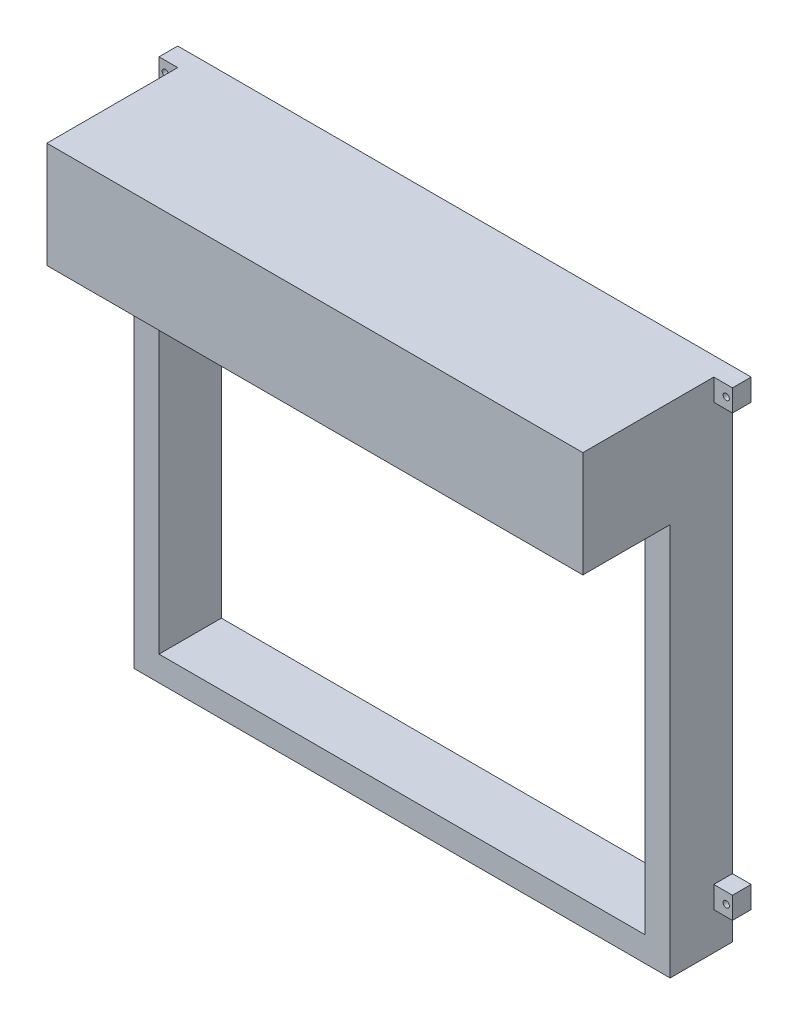
ISO-10303-21;
HEADER;
FILE_DESCRIPTION(('STEP AP214'),'2;1');
FILE_NAME('part.step','',(''),(''),'','','');
FILE_SCHEMA(('AUTOMOTIVE_DESIGN { 1 0 10303 214 1 1 1 1 }'));
ENDSEC;
DATA;
#1=APPLICATION_CONTEXT('core data for automotive mechanical design processes');
#2=APPLICATION_PROTOCOL_DEFINITION('international standard','automotive_design',2000,#1);
#3=PRODUCT_CONTEXT('',#1,'mechanical');
#4=PRODUCT('Part','Part','',(#3));
#5=PRODUCT_RELATED_PRODUCT_CATEGORY('part','',(#4));
#6=PRODUCT_DEFINITION_FORMATION('','',#4);
#7=PRODUCT_DEFINITION_CONTEXT('part definition',#1,'design');
#8=PRODUCT_DEFINITION('design','',#6,#7);
#9=PRODUCT_DEFINITION_SHAPE('','',#8);
#10=(LENGTH_UNIT() NAMED_UNIT(*) SI_UNIT(.MILLI.,.METRE.));
#11=(NAMED_UNIT(*) PLANE_ANGLE_UNIT() SI_UNIT($,.RADIAN.));
#12=(NAMED_UNIT(*) SI_UNIT($,.STERADIAN.) SOLID_ANGLE_UNIT());
#13=UNCERTAINTY_MEASURE_WITH_UNIT(LENGTH_MEASURE(1.E-05),#10,'distance_accuracy_value','');
#14=(GEOMETRIC_REPRESENTATION_CONTEXT(3) GLOBAL_UNCERTAINTY_ASSIGNED_CONTEXT((#13)) GLOBAL_UNIT_ASSIGNED_CONTEXT((#10,
#11,#12)) REPRESENTATION_CONTEXT('',''));
#15=CARTESIAN_POINT('',(0.,0.,0.));
#16=DIRECTION('',(0.,0.,1.));
#17=DIRECTION('',(1.,0.,0.));
#18=AXIS2_PLACEMENT_3D('',#15,#16,#17);
#19=CARTESIAN_POINT('',(860.,1.2490009027033E-13,100.));
#20=DIRECTION('',(1.,0.,0.));
#21=DIRECTION('',(0.,1.,0.));
#22=AXIS2_PLACEMENT_3D('',#19,#20,#21);
#23=PLANE('',#22);
#24=DIRECTION('',(0.,-1.,0.));
#25=VECTOR('',#24,1.);
#26=CARTESIAN_POINT('',(860.,1.2490009027033E-13,0.));
#27=LINE('',#26,#25);
#28=CARTESIAN_POINT('',(860.,765.,0.));
#29=VERTEX_POINT('',#28);
#30=CARTESIAN_POINT('',(860.,95.0000000000001,0.));
#31=VERTEX_POINT('',#30);
#32=EDGE_CURVE('E403',#29,#31,#27,.T.);
#33=ORIENTED_EDGE('',*,*,#32,.F.);
#34=DIRECTION('',(0.,0.,-1.));
#35=VECTOR('',#34,1.);
#36=CARTESIAN_POINT('',(860.,765.,30.));
#37=LINE('',#36,#35);
#38=CARTESIAN_POINT('',(860.,765.,30.));
#39=VERTEX_POINT('',#38);
#40=EDGE_CURVE('E256',#39,#29,#37,.T.);
#41=ORIENTED_EDGE('',*,*,#40,.F.);
#42=DIRECTION('',(0.,-1.,0.));
#43=VECTOR('',#42,1.);
#44=CARTESIAN_POINT('',(860.,1.2490009027033E-13,30.));
#45=LINE('',#44,#43);
#46=CARTESIAN_POINT('',(860.,800.,30.));
#47=VERTEX_POINT('',#46);
#48=EDGE_CURVE('E273',#47,#39,#45,.T.);
#49=ORIENTED_EDGE('',*,*,#48,.F.);
#50=DIRECTION('',(0.,0.,-1.));
#51=VECTOR('',#50,1.);
#52=CARTESIAN_POINT('',(860.,800.,240.));
#53=LINE('',#52,#51);
#54=CARTESIAN_POINT('',(860.,800.,240.));
#55=VERTEX_POINT('',#54);
#56=EDGE_CURVE('E366',#55,#47,#53,.T.);
#57=ORIENTED_EDGE('',*,*,#56,.F.);
#58=DIRECTION('',(0.,-1.,0.));
#59=VECTOR('',#58,1.);
#60=CARTESIAN_POINT('',(860.,1.2490009027033E-13,240.));
#61=LINE('',#60,#59);
#62=CARTESIAN_POINT('',(860.,630.,240.));
#63=VERTEX_POINT('',#62);
#64=EDGE_CURVE('E357',#55,#63,#61,.T.);
#65=ORIENTED_EDGE('',*,*,#64,.T.);
#66=DIRECTION('',(0.,0.,-1.));
#67=VECTOR('',#66,1.);
#68=CARTESIAN_POINT('',(860.,630.,240.));
#69=LINE('',#68,#67);
#70=CARTESIAN_POINT('',(860.,630.,100.));
#71=VERTEX_POINT('',#70);
#72=EDGE_CURVE('E369',#63,#71,#69,.T.);
#73=ORIENTED_EDGE('',*,*,#72,.T.);
#74=DIRECTION('',(0.,-1.,0.));
#75=VECTOR('',#74,1.);
#76=CARTESIAN_POINT('',(860.,1.2490009027033E-13,100.));
#77=LINE('',#76,#75);
#78=CARTESIAN_POINT('',(860.,0.,100.));
#79=VERTEX_POINT('',#78);
#80=EDGE_CURVE('E385',#71,#79,#77,.T.);
#81=ORIENTED_EDGE('',*,*,#80,.T.);
#82=DIRECTION('',(0.,0.,-1.));
#83=VECTOR('',#82,1.);
#84=CARTESIAN_POINT('',(860.,0.,100.));
#85=LINE('',#84,#83);
#86=CARTESIAN_POINT('',(860.,0.,0.));
#87=VERTEX_POINT('',#86);
#88=EDGE_CURVE('E59',#79,#87,#85,.T.);
#89=ORIENTED_EDGE('',*,*,#88,.T.);
#90=CARTESIAN_POINT('',(860.,60.0000000000001,0.));
#91=VERTEX_POINT('',#90);
#92=EDGE_CURVE('E402',#91,#87,#27,.T.);
#93=ORIENTED_EDGE('',*,*,#92,.F.);
#94=DIRECTION('',(0.,0.,-1.));
#95=VECTOR('',#94,1.);
#96=CARTESIAN_POINT('',(860.,60.0000000000001,30.));
#97=LINE('',#96,#95);
#98=CARTESIAN_POINT('',(860.,60.0000000000001,30.));
#99=VERTEX_POINT('',#98);
#100=EDGE_CURVE('E290',#99,#91,#97,.T.);
#101=ORIENTED_EDGE('',*,*,#100,.F.);
#102=DIRECTION('',(0.,-1.,0.));
#103=VECTOR('',#102,1.);
#104=CARTESIAN_POINT('',(860.,1.2490009027033E-13,30.));
#105=LINE('',#104,#103);
#106=CARTESIAN_POINT('',(860.,95.0000000000001,30.));
#107=VERTEX_POINT('',#106);
#108=EDGE_CURVE('E292',#107,#99,#105,.T.);
#109=ORIENTED_EDGE('',*,*,#108,.F.);
#110=DIRECTION('',(0.,0.,-1.));
#111=VECTOR('',#110,1.);
#112=CARTESIAN_POINT('',(860.,95.0000000000001,30.));
#113=LINE('',#112,#111);
#114=EDGE_CURVE('E287',#107,#31,#113,.T.);
#115=ORIENTED_EDGE('',*,*,#114,.T.);
#116=EDGE_LOOP('',(#33,#41,#49,#57,#65,#73,#81,#89,#93,#101,#109,#115));
#117=FACE_BOUND('',#116,.T.);
#118=ADVANCED_FACE('F51',(#117),#23,.T.);
#119=CARTESIAN_POINT('',(0.,0.,100.));
#120=DIRECTION('',(-1.,0.,0.));
#121=DIRECTION('',(0.,0.,1.));
#122=AXIS2_PLACEMENT_3D('',#119,#120,#121);
#123=PLANE('',#122);
#124=DIRECTION('',(0.,-1.,0.));
#125=VECTOR('',#124,1.);
#126=CARTESIAN_POINT('',(0.,800.,30.));
#127=LINE('',#126,#125);
#128=CARTESIAN_POINT('',(0.,800.,30.));
#129=VERTEX_POINT('',#128);
#130=CARTESIAN_POINT('',(0.,765.,30.));
#131=VERTEX_POINT('',#130);
#132=EDGE_CURVE('E66',#129,#131,#127,.T.);
#133=ORIENTED_EDGE('',*,*,#132,.T.);
#134=DIRECTION('',(0.,0.,-1.));
#135=VECTOR('',#134,1.);
#136=CARTESIAN_POINT('',(0.,765.,30.));
#137=LINE('',#136,#135);
#138=CARTESIAN_POINT('',(0.,765.,0.));
#139=VERTEX_POINT('',#138);
#140=EDGE_CURVE('E70',#131,#139,#137,.T.);
#141=ORIENTED_EDGE('',*,*,#140,.T.);
#142=DIRECTION('',(0.,1.,0.));
#143=VECTOR('',#142,1.);
#144=CARTESIAN_POINT('',(0.,0.,0.));
#145=LINE('',#144,#143);
#146=CARTESIAN_POINT('',(0.,94.9999999999999,0.));
#147=VERTEX_POINT('',#146);
#148=EDGE_CURVE('E374',#147,#139,#145,.T.);
#149=ORIENTED_EDGE('',*,*,#148,.F.);
#150=DIRECTION('',(0.,0.,-1.));
#151=VECTOR('',#150,1.);
#152=CARTESIAN_POINT('',(0.,94.9999999999999,30.));
#153=LINE('',#152,#151);
#154=CARTESIAN_POINT('',(0.,94.9999999999999,30.));
#155=VERTEX_POINT('',#154);
#156=EDGE_CURVE('E345',#155,#147,#153,.T.);
#157=ORIENTED_EDGE('',*,*,#156,.F.);
#158=DIRECTION('',(0.,1.,0.));
#159=VECTOR('',#158,1.);
#160=CARTESIAN_POINT('',(0.,0.,30.));
#161=LINE('',#160,#159);
#162=CARTESIAN_POINT('',(0.,59.9999999999999,30.));
#163=VERTEX_POINT('',#162);
#164=EDGE_CURVE('E328',#163,#155,#161,.T.);
#165=ORIENTED_EDGE('',*,*,#164,.F.);
#166=DIRECTION('',(0.,0.,-1.));
#167=VECTOR('',#166,1.);
#168=CARTESIAN_POINT('',(0.,59.9999999999999,30.));
#169=LINE('',#168,#167);
#170=CARTESIAN_POINT('',(0.,59.9999999999999,0.));
#171=VERTEX_POINT('',#170);
#172=EDGE_CURVE('E348',#163,#171,#169,.T.);
#173=ORIENTED_EDGE('',*,*,#172,.T.);
#174=CARTESIAN_POINT('',(0.,0.,0.));
#175=VERTEX_POINT('',#174);
#176=EDGE_CURVE('E396',#175,#171,#145,.T.);
#177=ORIENTED_EDGE('',*,*,#176,.F.);
#178=DIRECTION('',(0.,0.,-1.));
#179=VECTOR('',#178,1.);
#180=CARTESIAN_POINT('',(0.,0.,100.));
#181=LINE('',#180,#179);
#182=CARTESIAN_POINT('',(0.,0.,100.));
#183=VERTEX_POINT('',#182);
#184=EDGE_CURVE('E12',#183,#175,#181,.T.);
#185=ORIENTED_EDGE('',*,*,#184,.F.);
#186=DIRECTION('',(0.,1.,0.));
#187=VECTOR('',#186,1.);
#188=CARTESIAN_POINT('',(0.,0.,100.));
#189=LINE('',#188,#187);
#190=CARTESIAN_POINT('',(0.,630.,100.));
#191=VERTEX_POINT('',#190);
#192=EDGE_CURVE('E377',#183,#191,#189,.T.);
#193=ORIENTED_EDGE('',*,*,#192,.T.);
#194=DIRECTION('',(0.,0.,-1.));
#195=VECTOR('',#194,1.);
#196=CARTESIAN_POINT('',(0.,630.,240.));
#197=LINE('',#196,#195);
#198=CARTESIAN_POINT('',(0.,630.,240.));
#199=VERTEX_POINT('',#198);
#200=EDGE_CURVE('E372',#199,#191,#197,.T.);
#201=ORIENTED_EDGE('',*,*,#200,.F.);
#202=DIRECTION('',(0.,1.,0.));
#203=VECTOR('',#202,1.);
#204=CARTESIAN_POINT('',(0.,0.,240.));
#205=LINE('',#204,#203);
#206=CARTESIAN_POINT('',(0.,800.,240.));
#207=VERTEX_POINT('',#206);
#208=EDGE_CURVE('E222',#199,#207,#205,.T.);
#209=ORIENTED_EDGE('',*,*,#208,.T.);
#210=DIRECTION('',(0.,0.,-1.));
#211=VECTOR('',#210,1.);
#212=CARTESIAN_POINT('',(0.,800.,240.));
#213=LINE('',#212,#211);
#214=EDGE_CURVE('E363',#207,#129,#213,.T.);
#215=ORIENTED_EDGE('',*,*,#214,.T.);
#216=EDGE_LOOP('',(#133,#141,#149,#157,#165,#173,#177,#185,#193,#201,#209,#215));
#217=FACE_BOUND('',#216,.T.);
#218=ADVANCED_FACE('F53',(#217),#123,.T.);
#219=CARTESIAN_POINT('',(0.,0.,100.));
#220=DIRECTION('',(0.,-1.,0.));
#221=DIRECTION('',(0.,0.,-1.));
#222=AXIS2_PLACEMENT_3D('',#219,#220,#221);
#223=PLANE('',#222);
#224=DIRECTION('',(-1.,0.,0.));
#225=VECTOR('',#224,1.);
#226=CARTESIAN_POINT('',(0.,0.,0.));
#227=LINE('',#226,#225);
#228=EDGE_CURVE('E399',#87,#175,#227,.T.);
#229=ORIENTED_EDGE('',*,*,#228,.F.);
#230=ORIENTED_EDGE('',*,*,#88,.F.);
#231=DIRECTION('',(-1.,0.,0.));
#232=VECTOR('',#231,1.);
#233=CARTESIAN_POINT('',(0.,0.,100.));
#234=LINE('',#233,#232);
#235=EDGE_CURVE('E382',#79,#183,#234,.T.);
#236=ORIENTED_EDGE('',*,*,#235,.T.);
#237=ORIENTED_EDGE('',*,*,#184,.T.);
#238=EDGE_LOOP('',(#229,#230,#236,#237));
#239=FACE_BOUND('',#238,.T.);
#240=ADVANCED_FACE('F430',(#239),#223,.T.);
#241=CARTESIAN_POINT('',(820.,1.52655665885959E-13,100.));
#242=DIRECTION('',(1.,0.,0.));
#243=DIRECTION('',(0.,1.,0.));
#244=AXIS2_PLACEMENT_3D('',#241,#242,#243);
#245=PLANE('',#244);
#246=DIRECTION('',(0.,-1.,0.));
#247=VECTOR('',#246,1.);
#248=CARTESIAN_POINT('',(820.,1.52655665885959E-13,0.));
#249=LINE('',#248,#247);
#250=CARTESIAN_POINT('',(820.,630.,0.));
#251=VERTEX_POINT('',#250);
#252=CARTESIAN_POINT('',(820.,40.,0.));
#253=VERTEX_POINT('',#252);
#254=EDGE_CURVE('E405',#251,#253,#249,.T.);
#255=ORIENTED_EDGE('',*,*,#254,.T.);
#256=DIRECTION('',(0.,0.,-1.));
#257=VECTOR('',#256,1.);
#258=CARTESIAN_POINT('',(820.,40.,100.));
#259=LINE('',#258,#257);
#260=CARTESIAN_POINT('',(820.,40.,100.));
#261=VERTEX_POINT('',#260);
#262=EDGE_CURVE('E416',#261,#253,#259,.T.);
#263=ORIENTED_EDGE('',*,*,#262,.F.);
#264=DIRECTION('',(0.,-1.,0.));
#265=VECTOR('',#264,1.);
#266=CARTESIAN_POINT('',(820.,1.52655665885959E-13,100.));
#267=LINE('',#266,#265);
#268=CARTESIAN_POINT('',(820.,630.,100.));
#269=VERTEX_POINT('',#268);
#270=EDGE_CURVE('E388',#269,#261,#267,.T.);
#271=ORIENTED_EDGE('',*,*,#270,.F.);
#272=DIRECTION('',(0.,0.,-1.));
#273=VECTOR('',#272,1.);
#274=CARTESIAN_POINT('',(820.,630.,100.));
#275=LINE('',#274,#273);
#276=EDGE_CURVE('E419',#269,#251,#275,.T.);
#277=ORIENTED_EDGE('',*,*,#276,.T.);
#278=EDGE_LOOP('',(#255,#263,#271,#277));
#279=FACE_BOUND('',#278,.T.);
#280=ADVANCED_FACE('F499',(#279),#245,.F.);
#281=CARTESIAN_POINT('',(0.,40.,100.));
#282=DIRECTION('',(0.,-1.,0.));
#283=DIRECTION('',(0.,0.,-1.));
#284=AXIS2_PLACEMENT_3D('',#281,#282,#283);
#285=PLANE('',#284);
#286=DIRECTION('',(-1.,0.,0.));
#287=VECTOR('',#286,1.);
#288=CARTESIAN_POINT('',(0.,40.,0.));
#289=LINE('',#288,#287);
#290=CARTESIAN_POINT('',(40.,40.,0.));
#291=VERTEX_POINT('',#290);
#292=EDGE_CURVE('E407',#253,#291,#289,.T.);
#293=ORIENTED_EDGE('',*,*,#292,.T.);
#294=DIRECTION('',(0.,0.,-1.));
#295=VECTOR('',#294,1.);
#296=CARTESIAN_POINT('',(40.,40.,100.));
#297=LINE('',#296,#295);
#298=CARTESIAN_POINT('',(40.,40.,100.));
#299=VERTEX_POINT('',#298);
#300=EDGE_CURVE('E413',#299,#291,#297,.T.);
#301=ORIENTED_EDGE('',*,*,#300,.F.);
#302=DIRECTION('',(-1.,0.,0.));
#303=VECTOR('',#302,1.);
#304=CARTESIAN_POINT('',(0.,40.,100.));
#305=LINE('',#304,#303);
#306=EDGE_CURVE('E390',#261,#299,#305,.T.);
#307=ORIENTED_EDGE('',*,*,#306,.F.);
#308=ORIENTED_EDGE('',*,*,#262,.T.);
#309=EDGE_LOOP('',(#293,#301,#307,#308));
#310=FACE_BOUND('',#309,.T.);
#311=ADVANCED_FACE('F505',(#310),#285,.F.);
#312=CARTESIAN_POINT('',(40.,0.,100.));
#313=DIRECTION('',(-1.,0.,0.));
#314=DIRECTION('',(0.,0.,1.));
#315=AXIS2_PLACEMENT_3D('',#312,#313,#314);
#316=PLANE('',#315);
#317=DIRECTION('',(0.,1.,0.));
#318=VECTOR('',#317,1.);
#319=CARTESIAN_POINT('',(40.,0.,0.));
#320=LINE('',#319,#318);
#321=CARTESIAN_POINT('',(40.,630.,0.));
#322=VERTEX_POINT('',#321);
#323=EDGE_CURVE('E378',#291,#322,#320,.T.);
#324=ORIENTED_EDGE('',*,*,#323,.T.);
#325=DIRECTION('',(0.,0.,-1.));
#326=VECTOR('',#325,1.);
#327=CARTESIAN_POINT('',(40.,630.,100.));
#328=LINE('',#327,#326);
#329=CARTESIAN_POINT('',(40.,630.,100.));
#330=VERTEX_POINT('',#329);
#331=EDGE_CURVE('E395',#330,#322,#328,.T.);
#332=ORIENTED_EDGE('',*,*,#331,.F.);
#333=DIRECTION('',(0.,1.,0.));
#334=VECTOR('',#333,1.);
#335=CARTESIAN_POINT('',(40.,0.,100.));
#336=LINE('',#335,#334);
#337=EDGE_CURVE('E392',#299,#330,#336,.T.);
#338=ORIENTED_EDGE('',*,*,#337,.F.);
#339=ORIENTED_EDGE('',*,*,#300,.T.);
#340=EDGE_LOOP('',(#324,#332,#338,#339));
#341=FACE_BOUND('',#340,.T.);
#342=ADVANCED_FACE('F510',(#341),#316,.F.);
#343=CARTESIAN_POINT('',(0.,0.,100.));
#344=DIRECTION('',(0.,0.,1.));
#345=DIRECTION('',(1.,0.,0.));
#346=AXIS2_PLACEMENT_3D('',#343,#344,#345);
#347=PLANE('',#346);
#348=DIRECTION('',(1.,0.,0.));
#349=VECTOR('',#348,1.);
#350=CARTESIAN_POINT('',(0.,630.,100.));
#351=LINE('',#350,#349);
#352=EDGE_CURVE('E375',#191,#330,#351,.T.);
#353=ORIENTED_EDGE('',*,*,#352,.F.);
#354=ORIENTED_EDGE('',*,*,#192,.F.);
#355=ORIENTED_EDGE('',*,*,#235,.F.);
#356=ORIENTED_EDGE('',*,*,#80,.F.);
#357=EDGE_CURVE('E379',#269,#71,#351,.T.);
#358=ORIENTED_EDGE('',*,*,#357,.F.);
#359=ORIENTED_EDGE('',*,*,#270,.T.);
#360=ORIENTED_EDGE('',*,*,#306,.T.);
#361=ORIENTED_EDGE('',*,*,#337,.T.);
#362=EDGE_LOOP('',(#353,#354,#355,#356,#358,#359,#360,#361));
#363=FACE_BOUND('',#362,.T.);
#364=ADVANCED_FACE('F465',(#363),#347,.T.);
#365=CARTESIAN_POINT('',(0.,0.,0.));
#366=DIRECTION('',(0.,0.,1.));
#367=DIRECTION('',(1.,0.,0.));
#368=AXIS2_PLACEMENT_3D('',#365,#366,#367);
#369=PLANE('',#368);
#370=DIRECTION('',(1.,0.,0.));
#371=VECTOR('',#370,1.);
#372=CARTESIAN_POINT('',(0.,800.,0.));
#373=LINE('',#372,#371);
#374=CARTESIAN_POINT('',(-30.,800.,0.));
#375=VERTEX_POINT('',#374);
#376=CARTESIAN_POINT('',(890.,800.,0.));
#377=VERTEX_POINT('',#376);
#378=EDGE_CURVE('E210',#375,#377,#373,.T.);
#379=ORIENTED_EDGE('',*,*,#378,.T.);
#380=DIRECTION('',(0.,-1.,0.));
#381=VECTOR('',#380,1.);
#382=CARTESIAN_POINT('',(890.,0.,0.));
#383=LINE('',#382,#381);
#384=CARTESIAN_POINT('',(890.,765.,0.));
#385=VERTEX_POINT('',#384);
#386=EDGE_CURVE('E265',#377,#385,#383,.T.);
#387=ORIENTED_EDGE('',*,*,#386,.T.);
#388=DIRECTION('',(1.,0.,0.));
#389=VECTOR('',#388,1.);
#390=CARTESIAN_POINT('',(0.,765.,0.));
#391=LINE('',#390,#389);
#392=EDGE_CURVE('E262',#29,#385,#391,.T.);
#393=ORIENTED_EDGE('',*,*,#392,.F.);
#394=ORIENTED_EDGE('',*,*,#32,.T.);
#395=DIRECTION('',(1.,0.,0.));
#396=VECTOR('',#395,1.);
#397=CARTESIAN_POINT('',(0.,95.0000000000001,0.));
#398=LINE('',#397,#396);
#399=CARTESIAN_POINT('',(890.,95.0000000000001,0.));
#400=VERTEX_POINT('',#399);
#401=EDGE_CURVE('E293',#31,#400,#398,.T.);
#402=ORIENTED_EDGE('',*,*,#401,.T.);
#403=DIRECTION('',(0.,1.,0.));
#404=VECTOR('',#403,1.);
#405=CARTESIAN_POINT('',(890.,0.,0.));
#406=LINE('',#405,#404);
#407=CARTESIAN_POINT('',(890.,60.0000000000001,0.));
#408=VERTEX_POINT('',#407);
#409=EDGE_CURVE('E296',#408,#400,#406,.T.);
#410=ORIENTED_EDGE('',*,*,#409,.F.);
#411=DIRECTION('',(1.,0.,0.));
#412=VECTOR('',#411,1.);
#413=CARTESIAN_POINT('',(0.,60.0000000000013,0.));
#414=LINE('',#413,#412);
#415=EDGE_CURVE('E300',#91,#408,#414,.T.);
#416=ORIENTED_EDGE('',*,*,#415,.F.);
#417=ORIENTED_EDGE('',*,*,#92,.T.);
#418=ORIENTED_EDGE('',*,*,#228,.T.);
#419=ORIENTED_EDGE('',*,*,#176,.T.);
#420=DIRECTION('',(-1.,0.,0.));
#421=VECTOR('',#420,1.);
#422=CARTESIAN_POINT('',(0.,59.9999999999999,0.));
#423=LINE('',#422,#421);
#424=CARTESIAN_POINT('',(-30.,59.9999999999999,0.));
#425=VERTEX_POINT('',#424);
#426=EDGE_CURVE('E339',#171,#425,#423,.T.);
#427=ORIENTED_EDGE('',*,*,#426,.T.);
#428=DIRECTION('',(0.,1.,0.));
#429=VECTOR('',#428,1.);
#430=CARTESIAN_POINT('',(-30.,0.,0.));
#431=LINE('',#430,#429);
#432=CARTESIAN_POINT('',(-30.,94.9999999999999,0.));
#433=VERTEX_POINT('',#432);
#434=EDGE_CURVE('E336',#425,#433,#431,.T.);
#435=ORIENTED_EDGE('',*,*,#434,.T.);
#436=DIRECTION('',(-1.,0.,0.));
#437=VECTOR('',#436,1.);
#438=CARTESIAN_POINT('',(0.,94.9999999999999,0.));
#439=LINE('',#438,#437);
#440=EDGE_CURVE('E322',#147,#433,#439,.T.);
#441=ORIENTED_EDGE('',*,*,#440,.F.);
#442=ORIENTED_EDGE('',*,*,#148,.T.);
#443=DIRECTION('',(-1.,0.,0.));
#444=VECTOR('',#443,1.);
#445=CARTESIAN_POINT('',(0.,765.,0.));
#446=LINE('',#445,#444);
#447=CARTESIAN_POINT('',(-30.,765.,0.));
#448=VERTEX_POINT('',#447);
#449=EDGE_CURVE('E237',#139,#448,#446,.T.);
#450=ORIENTED_EDGE('',*,*,#449,.T.);
#451=DIRECTION('',(0.,-1.,0.));
#452=VECTOR('',#451,1.);
#453=CARTESIAN_POINT('',(-30.,800.,0.));
#454=LINE('',#453,#452);
#455=EDGE_CURVE('E229',#375,#448,#454,.T.);
#456=ORIENTED_EDGE('',*,*,#455,.F.);
#457=EDGE_LOOP('',(#379,#387,#393,#394,#402,#410,#416,#417,#418,#419,#427,#435,#441,#442,#450,#456));
#458=FACE_BOUND('',#457,.T.);
#459=ORIENTED_EDGE('',*,*,#254,.F.);
#460=DIRECTION('',(1.,0.,0.));
#461=VECTOR('',#460,1.);
#462=CARTESIAN_POINT('',(0.,630.,0.));
#463=LINE('',#462,#461);
#464=EDGE_CURVE('E223',#322,#251,#463,.T.);
#465=ORIENTED_EDGE('',*,*,#464,.F.);
#466=ORIENTED_EDGE('',*,*,#323,.F.);
#467=ORIENTED_EDGE('',*,*,#292,.F.);
#468=EDGE_LOOP('',(#459,#465,#466,#467));
#469=FACE_BOUND('',#468,.T.);
#470=CARTESIAN_POINT('',(-20.,77.4999999999999,0.));
#471=DIRECTION('',(0.,0.,1.));
#472=DIRECTION('',(1.,0.,0.));
#473=AXIS2_PLACEMENT_3D('',#470,#471,#472);
#474=CIRCLE('',#473,5.);
#475=CARTESIAN_POINT('',(-15.,77.4999999999999,0.));
#476=VERTEX_POINT('',#475);
#477=EDGE_CURVE('E306',#476,#476,#474,.T.);
#478=ORIENTED_EDGE('',*,*,#477,.T.);
#479=EDGE_LOOP('',(#478));
#480=FACE_BOUND('',#479,.T.);
#481=CARTESIAN_POINT('',(880.,77.5000000000001,0.));
#482=DIRECTION('',(0.,0.,1.));
#483=DIRECTION('',(1.,0.,0.));
#484=AXIS2_PLACEMENT_3D('',#481,#482,#483);
#485=CIRCLE('',#484,5.00000000000005);
#486=CARTESIAN_POINT('',(885.,77.5000000000001,0.));
#487=VERTEX_POINT('',#486);
#488=EDGE_CURVE('E303',#487,#487,#485,.T.);
#489=ORIENTED_EDGE('',*,*,#488,.T.);
#490=EDGE_LOOP('',(#489));
#491=FACE_BOUND('',#490,.T.);
#492=CARTESIAN_POINT('',(880.,782.5,0.));
#493=DIRECTION('',(0.,0.,1.));
#494=DIRECTION('',(1.,0.,0.));
#495=AXIS2_PLACEMENT_3D('',#492,#493,#494);
#496=CIRCLE('',#495,5.00000000000005);
#497=CARTESIAN_POINT('',(885.,782.5,0.));
#498=VERTEX_POINT('',#497);
#499=EDGE_CURVE('E268',#498,#498,#496,.T.);
#500=ORIENTED_EDGE('',*,*,#499,.T.);
#501=EDGE_LOOP('',(#500));
#502=FACE_BOUND('',#501,.T.);
#503=CARTESIAN_POINT('',(-20.,782.720518287023,0.));
#504=DIRECTION('',(0.,0.,1.));
#505=DIRECTION('',(1.,0.,0.));
#506=AXIS2_PLACEMENT_3D('',#503,#504,#505);
#507=CIRCLE('',#506,5.);
#508=CARTESIAN_POINT('',(-15.,782.720518287023,0.));
#509=VERTEX_POINT('',#508);
#510=EDGE_CURVE('E250',#509,#509,#507,.T.);
#511=ORIENTED_EDGE('',*,*,#510,.T.);
#512=EDGE_LOOP('',(#511));
#513=FACE_BOUND('',#512,.T.);
#514=ADVANCED_FACE('F234',(#458,#469,#480,#491,#502,#513),#369,.F.);
#515=CARTESIAN_POINT('',(0.,630.,240.));
#516=DIRECTION('',(0.,1.,0.));
#517=DIRECTION('',(0.,0.,1.));
#518=AXIS2_PLACEMENT_3D('',#515,#516,#517);
#519=PLANE('',#518);
#520=ORIENTED_EDGE('',*,*,#464,.T.);
#521=ORIENTED_EDGE('',*,*,#276,.F.);
#522=ORIENTED_EDGE('',*,*,#357,.T.);
#523=ORIENTED_EDGE('',*,*,#72,.F.);
#524=DIRECTION('',(1.,0.,0.));
#525=VECTOR('',#524,1.);
#526=CARTESIAN_POINT('',(0.,630.,240.));
#527=LINE('',#526,#525);
#528=EDGE_CURVE('E355',#199,#63,#527,.T.);
#529=ORIENTED_EDGE('',*,*,#528,.F.);
#530=ORIENTED_EDGE('',*,*,#200,.T.);
#531=ORIENTED_EDGE('',*,*,#352,.T.);
#532=ORIENTED_EDGE('',*,*,#331,.T.);
#533=EDGE_LOOP('',(#520,#521,#522,#523,#529,#530,#531,#532));
#534=FACE_BOUND('',#533,.T.);
#535=ADVANCED_FACE('F461',(#534),#519,.F.);
#536=CARTESIAN_POINT('',(0.,800.,240.));
#537=DIRECTION('',(0.,1.,0.));
#538=DIRECTION('',(0.,0.,1.));
#539=AXIS2_PLACEMENT_3D('',#536,#537,#538);
#540=PLANE('',#539);
#541=ORIENTED_EDGE('',*,*,#378,.F.);
#542=DIRECTION('',(0.,0.,-1.));
#543=VECTOR('',#542,1.);
#544=CARTESIAN_POINT('',(-30.,800.,30.));
#545=LINE('',#544,#543);
#546=CARTESIAN_POINT('',(-30.,800.,30.));
#547=VERTEX_POINT('',#546);
#548=EDGE_CURVE('E214',#547,#375,#545,.T.);
#549=ORIENTED_EDGE('',*,*,#548,.F.);
#550=DIRECTION('',(-1.,0.,0.));
#551=VECTOR('',#550,1.);
#552=CARTESIAN_POINT('',(0.,800.,30.));
#553=LINE('',#552,#551);
#554=EDGE_CURVE('E247',#129,#547,#553,.T.);
#555=ORIENTED_EDGE('',*,*,#554,.F.);
#556=ORIENTED_EDGE('',*,*,#214,.F.);
#557=DIRECTION('',(1.,0.,0.));
#558=VECTOR('',#557,1.);
#559=CARTESIAN_POINT('',(0.,800.,240.));
#560=LINE('',#559,#558);
#561=EDGE_CURVE('E360',#207,#55,#560,.T.);
#562=ORIENTED_EDGE('',*,*,#561,.T.);
#563=ORIENTED_EDGE('',*,*,#56,.T.);
#564=DIRECTION('',(1.,0.,0.));
#565=VECTOR('',#564,1.);
#566=CARTESIAN_POINT('',(0.,800.,30.));
#567=LINE('',#566,#565);
#568=CARTESIAN_POINT('',(890.,800.,30.));
#569=VERTEX_POINT('',#568);
#570=EDGE_CURVE('E276',#47,#569,#567,.T.);
#571=ORIENTED_EDGE('',*,*,#570,.T.);
#572=DIRECTION('',(0.,0.,-1.));
#573=VECTOR('',#572,1.);
#574=CARTESIAN_POINT('',(890.,800.,30.));
#575=LINE('',#574,#573);
#576=EDGE_CURVE('E217',#569,#377,#575,.T.);
#577=ORIENTED_EDGE('',*,*,#576,.T.);
#578=EDGE_LOOP('',(#541,#549,#555,#556,#562,#563,#571,#577));
#579=FACE_BOUND('',#578,.T.);
#580=ADVANCED_FACE('F212',(#579),#540,.T.);
#581=CARTESIAN_POINT('',(0.,0.,240.));
#582=DIRECTION('',(0.,0.,1.));
#583=DIRECTION('',(1.,0.,0.));
#584=AXIS2_PLACEMENT_3D('',#581,#582,#583);
#585=PLANE('',#584);
#586=ORIENTED_EDGE('',*,*,#208,.F.);
#587=ORIENTED_EDGE('',*,*,#528,.T.);
#588=ORIENTED_EDGE('',*,*,#64,.F.);
#589=ORIENTED_EDGE('',*,*,#561,.F.);
#590=EDGE_LOOP('',(#586,#587,#588,#589));
#591=FACE_BOUND('',#590,.T.);
#592=ADVANCED_FACE('F457',(#591),#585,.T.);
#593=CARTESIAN_POINT('',(-30.,0.,30.));
#594=DIRECTION('',(-1.,0.,0.));
#595=DIRECTION('',(0.,0.,1.));
#596=AXIS2_PLACEMENT_3D('',#593,#594,#595);
#597=PLANE('',#596);
#598=ORIENTED_EDGE('',*,*,#434,.F.);
#599=DIRECTION('',(0.,0.,-1.));
#600=VECTOR('',#599,1.);
#601=CARTESIAN_POINT('',(-30.,59.9999999999999,30.));
#602=LINE('',#601,#600);
#603=CARTESIAN_POINT('',(-30.,59.9999999999999,30.));
#604=VERTEX_POINT('',#603);
#605=EDGE_CURVE('E351',#604,#425,#602,.T.);
#606=ORIENTED_EDGE('',*,*,#605,.F.);
#607=DIRECTION('',(0.,1.,0.));
#608=VECTOR('',#607,1.);
#609=CARTESIAN_POINT('',(-30.,0.,30.));
#610=LINE('',#609,#608);
#611=CARTESIAN_POINT('',(-30.,94.9999999999999,30.));
#612=VERTEX_POINT('',#611);
#613=EDGE_CURVE('E321',#604,#612,#610,.T.);
#614=ORIENTED_EDGE('',*,*,#613,.T.);
#615=DIRECTION('',(0.,0.,-1.));
#616=VECTOR('',#615,1.);
#617=CARTESIAN_POINT('',(-30.,94.9999999999999,30.));
#618=LINE('',#617,#616);
#619=EDGE_CURVE('E333',#612,#433,#618,.T.);
#620=ORIENTED_EDGE('',*,*,#619,.T.);
#621=EDGE_LOOP('',(#598,#606,#614,#620));
#622=FACE_BOUND('',#621,.T.);
#623=ADVANCED_FACE('F478',(#622),#597,.T.);
#624=CARTESIAN_POINT('',(0.,59.9999999999999,30.));
#625=DIRECTION('',(0.,-1.,0.));
#626=DIRECTION('',(1.,0.,0.));
#627=AXIS2_PLACEMENT_3D('',#624,#625,#626);
#628=PLANE('',#627);
#629=ORIENTED_EDGE('',*,*,#426,.F.);
#630=ORIENTED_EDGE('',*,*,#172,.F.);
#631=DIRECTION('',(-1.,0.,0.));
#632=VECTOR('',#631,1.);
#633=CARTESIAN_POINT('',(0.,59.9999999999999,30.));
#634=LINE('',#633,#632);
#635=EDGE_CURVE('E325',#163,#604,#634,.T.);
#636=ORIENTED_EDGE('',*,*,#635,.T.);
#637=ORIENTED_EDGE('',*,*,#605,.T.);
#638=EDGE_LOOP('',(#629,#630,#636,#637));
#639=FACE_BOUND('',#638,.T.);
#640=ADVANCED_FACE('F471',(#639),#628,.T.);
#641=CARTESIAN_POINT('',(-20.,77.4999999999999,30.));
#642=DIRECTION('',(0.,0.,-1.));
#643=DIRECTION('',(-1.,0.,0.));
#644=AXIS2_PLACEMENT_3D('',#641,#642,#643);
#645=CYLINDRICAL_SURFACE('',#644,5.);
#646=CARTESIAN_POINT('',(-20.,77.4999999999999,30.));
#647=DIRECTION('',(0.,0.,1.));
#648=DIRECTION('',(1.,0.,0.));
#649=AXIS2_PLACEMENT_3D('',#646,#647,#648);
#650=CIRCLE('',#649,5.);
#651=CARTESIAN_POINT('',(-15.,77.4999999999999,30.));
#652=VERTEX_POINT('',#651);
#653=EDGE_CURVE('E318',#652,#652,#650,.T.);
#654=ORIENTED_EDGE('',*,*,#653,.T.);
#655=EDGE_LOOP('',(#654));
#656=FACE_BOUND('',#655,.T.);
#657=ORIENTED_EDGE('',*,*,#477,.F.);
#658=EDGE_LOOP('',(#657));
#659=FACE_BOUND('',#658,.T.);
#660=ADVANCED_FACE('F482',(#656,#659),#645,.F.);
#661=CARTESIAN_POINT('',(0.,94.9999999999999,30.));
#662=DIRECTION('',(0.,-1.,0.));
#663=DIRECTION('',(0.,0.,-1.));
#664=AXIS2_PLACEMENT_3D('',#661,#662,#663);
#665=PLANE('',#664);
#666=ORIENTED_EDGE('',*,*,#440,.T.);
#667=ORIENTED_EDGE('',*,*,#619,.F.);
#668=DIRECTION('',(-1.,0.,0.));
#669=VECTOR('',#668,1.);
#670=CARTESIAN_POINT('',(0.,94.9999999999999,30.));
#671=LINE('',#670,#669);
#672=EDGE_CURVE('E331',#155,#612,#671,.T.);
#673=ORIENTED_EDGE('',*,*,#672,.F.);
#674=ORIENTED_EDGE('',*,*,#156,.T.);
#675=EDGE_LOOP('',(#666,#667,#673,#674));
#676=FACE_BOUND('',#675,.T.);
#677=ADVANCED_FACE('F480',(#676),#665,.F.);
#678=CARTESIAN_POINT('',(0.,0.,30.));
#679=DIRECTION('',(0.,0.,1.));
#680=DIRECTION('',(1.,0.,0.));
#681=AXIS2_PLACEMENT_3D('',#678,#679,#680);
#682=PLANE('',#681);
#683=ORIENTED_EDGE('',*,*,#653,.F.);
#684=EDGE_LOOP('',(#683));
#685=FACE_BOUND('',#684,.T.);
#686=ORIENTED_EDGE('',*,*,#613,.F.);
#687=ORIENTED_EDGE('',*,*,#635,.F.);
#688=ORIENTED_EDGE('',*,*,#164,.T.);
#689=ORIENTED_EDGE('',*,*,#672,.T.);
#690=EDGE_LOOP('',(#686,#687,#688,#689));
#691=FACE_BOUND('',#690,.T.);
#692=ADVANCED_FACE('F474',(#685,#691),#682,.T.);
#693=CARTESIAN_POINT('',(0.,60.0000000000013,30.));
#694=DIRECTION('',(0.,1.,0.));
#695=DIRECTION('',(-1.,0.,0.));
#696=AXIS2_PLACEMENT_3D('',#693,#694,#695);
#697=PLANE('',#696);
#698=ORIENTED_EDGE('',*,*,#415,.T.);
#699=DIRECTION('',(0.,0.,-1.));
#700=VECTOR('',#699,1.);
#701=CARTESIAN_POINT('',(890.,60.0000000000001,30.));
#702=LINE('',#701,#700);
#703=CARTESIAN_POINT('',(890.,60.0000000000001,30.));
#704=VERTEX_POINT('',#703);
#705=EDGE_CURVE('E271',#704,#408,#702,.T.);
#706=ORIENTED_EDGE('',*,*,#705,.F.);
#707=DIRECTION('',(1.,0.,0.));
#708=VECTOR('',#707,1.);
#709=CARTESIAN_POINT('',(0.,60.0000000000013,30.));
#710=LINE('',#709,#708);
#711=EDGE_CURVE('E313',#99,#704,#710,.T.);
#712=ORIENTED_EDGE('',*,*,#711,.F.);
#713=ORIENTED_EDGE('',*,*,#100,.T.);
#714=EDGE_LOOP('',(#698,#706,#712,#713));
#715=FACE_BOUND('',#714,.T.);
#716=ADVANCED_FACE('F435',(#715),#697,.F.);
#717=CARTESIAN_POINT('',(890.,0.,30.));
#718=DIRECTION('',(-1.,0.,0.));
#719=DIRECTION('',(0.,0.,1.));
#720=AXIS2_PLACEMENT_3D('',#717,#718,#719);
#721=PLANE('',#720);
#722=ORIENTED_EDGE('',*,*,#409,.T.);
#723=DIRECTION('',(0.,0.,-1.));
#724=VECTOR('',#723,1.);
#725=CARTESIAN_POINT('',(890.,95.0000000000001,30.));
#726=LINE('',#725,#724);
#727=CARTESIAN_POINT('',(890.,95.0000000000001,30.));
#728=VERTEX_POINT('',#727);
#729=EDGE_CURVE('E285',#728,#400,#726,.T.);
#730=ORIENTED_EDGE('',*,*,#729,.F.);
#731=DIRECTION('',(0.,1.,0.));
#732=VECTOR('',#731,1.);
#733=CARTESIAN_POINT('',(890.,0.,30.));
#734=LINE('',#733,#732);
#735=EDGE_CURVE('E311',#704,#728,#734,.T.);
#736=ORIENTED_EDGE('',*,*,#735,.F.);
#737=ORIENTED_EDGE('',*,*,#705,.T.);
#738=EDGE_LOOP('',(#722,#730,#736,#737));
#739=FACE_BOUND('',#738,.T.);
#740=ADVANCED_FACE('F561',(#739),#721,.F.);
#741=CARTESIAN_POINT('',(0.,95.0000000000001,30.));
#742=DIRECTION('',(0.,1.,0.));
#743=DIRECTION('',(0.,0.,1.));
#744=AXIS2_PLACEMENT_3D('',#741,#742,#743);
#745=PLANE('',#744);
#746=ORIENTED_EDGE('',*,*,#401,.F.);
#747=ORIENTED_EDGE('',*,*,#114,.F.);
#748=DIRECTION('',(1.,0.,0.));
#749=VECTOR('',#748,1.);
#750=CARTESIAN_POINT('',(0.,95.0000000000001,30.));
#751=LINE('',#750,#749);
#752=EDGE_CURVE('E308',#107,#728,#751,.T.);
#753=ORIENTED_EDGE('',*,*,#752,.T.);
#754=ORIENTED_EDGE('',*,*,#729,.T.);
#755=EDGE_LOOP('',(#746,#747,#753,#754));
#756=FACE_BOUND('',#755,.T.);
#757=ADVANCED_FACE('F444',(#756),#745,.T.);
#758=CARTESIAN_POINT('',(880.,77.5000000000001,30.));
#759=DIRECTION('',(0.,0.,-1.));
#760=DIRECTION('',(-1.,0.,0.));
#761=AXIS2_PLACEMENT_3D('',#758,#759,#760);
#762=CYLINDRICAL_SURFACE('',#761,5.00000000000005);
#763=CARTESIAN_POINT('',(880.,77.5000000000001,30.));
#764=DIRECTION('',(0.,0.,1.));
#765=DIRECTION('',(1.,0.,0.));
#766=AXIS2_PLACEMENT_3D('',#763,#764,#765);
#767=CIRCLE('',#766,5.00000000000005);
#768=CARTESIAN_POINT('',(885.,77.5000000000001,30.));
#769=VERTEX_POINT('',#768);
#770=EDGE_CURVE('E297',#769,#769,#767,.T.);
#771=ORIENTED_EDGE('',*,*,#770,.T.);
#772=EDGE_LOOP('',(#771));
#773=FACE_BOUND('',#772,.T.);
#774=ORIENTED_EDGE('',*,*,#488,.F.);
#775=EDGE_LOOP('',(#774));
#776=FACE_BOUND('',#775,.T.);
#777=ADVANCED_FACE('F575',(#773,#776),#762,.F.);
#778=CARTESIAN_POINT('',(0.,0.,30.));
#779=DIRECTION('',(0.,0.,1.));
#780=DIRECTION('',(1.,0.,0.));
#781=AXIS2_PLACEMENT_3D('',#778,#779,#780);
#782=PLANE('',#781);
#783=ORIENTED_EDGE('',*,*,#770,.F.);
#784=EDGE_LOOP('',(#783));
#785=FACE_BOUND('',#784,.T.);
#786=ORIENTED_EDGE('',*,*,#711,.T.);
#787=ORIENTED_EDGE('',*,*,#735,.T.);
#788=ORIENTED_EDGE('',*,*,#752,.F.);
#789=ORIENTED_EDGE('',*,*,#108,.T.);
#790=EDGE_LOOP('',(#786,#787,#788,#789));
#791=FACE_BOUND('',#790,.T.);
#792=ADVANCED_FACE('F440',(#785,#791),#782,.T.);
#793=CARTESIAN_POINT('',(890.,0.,30.));
#794=DIRECTION('',(1.,0.,0.));
#795=DIRECTION('',(0.,0.,-1.));
#796=AXIS2_PLACEMENT_3D('',#793,#794,#795);
#797=PLANE('',#796);
#798=ORIENTED_EDGE('',*,*,#386,.F.);
#799=ORIENTED_EDGE('',*,*,#576,.F.);
#800=DIRECTION('',(0.,-1.,0.));
#801=VECTOR('',#800,1.);
#802=CARTESIAN_POINT('',(890.,0.,30.));
#803=LINE('',#802,#801);
#804=CARTESIAN_POINT('',(890.,765.,30.));
#805=VERTEX_POINT('',#804);
#806=EDGE_CURVE('E278',#569,#805,#803,.T.);
#807=ORIENTED_EDGE('',*,*,#806,.T.);
#808=DIRECTION('',(0.,0.,-1.));
#809=VECTOR('',#808,1.);
#810=CARTESIAN_POINT('',(890.,765.,30.));
#811=LINE('',#810,#809);
#812=EDGE_CURVE('E259',#805,#385,#811,.T.);
#813=ORIENTED_EDGE('',*,*,#812,.T.);
#814=EDGE_LOOP('',(#798,#799,#807,#813));
#815=FACE_BOUND('',#814,.T.);
#816=ADVANCED_FACE('F589',(#815),#797,.T.);
#817=CARTESIAN_POINT('',(880.,782.5,30.));
#818=DIRECTION('',(0.,0.,-1.));
#819=DIRECTION('',(-1.,0.,0.));
#820=AXIS2_PLACEMENT_3D('',#817,#818,#819);
#821=CYLINDRICAL_SURFACE('',#820,5.00000000000005);
#822=CARTESIAN_POINT('',(880.,782.5,30.));
#823=DIRECTION('',(0.,0.,1.));
#824=DIRECTION('',(1.,0.,0.));
#825=AXIS2_PLACEMENT_3D('',#822,#823,#824);
#826=CIRCLE('',#825,5.00000000000005);
#827=CARTESIAN_POINT('',(885.,782.5,30.));
#828=VERTEX_POINT('',#827);
#829=EDGE_CURVE('E266',#828,#828,#826,.T.);
#830=ORIENTED_EDGE('',*,*,#829,.T.);
#831=EDGE_LOOP('',(#830));
#832=FACE_BOUND('',#831,.T.);
#833=ORIENTED_EDGE('',*,*,#499,.F.);
#834=EDGE_LOOP('',(#833));
#835=FACE_BOUND('',#834,.T.);
#836=ADVANCED_FACE('F597',(#832,#835),#821,.F.);
#837=CARTESIAN_POINT('',(0.,765.,30.));
#838=DIRECTION('',(0.,1.,0.));
#839=DIRECTION('',(0.,0.,1.));
#840=AXIS2_PLACEMENT_3D('',#837,#838,#839);
#841=PLANE('',#840);
#842=ORIENTED_EDGE('',*,*,#392,.T.);
#843=ORIENTED_EDGE('',*,*,#812,.F.);
#844=DIRECTION('',(1.,0.,0.));
#845=VECTOR('',#844,1.);
#846=CARTESIAN_POINT('',(0.,765.,30.));
#847=LINE('',#846,#845);
#848=EDGE_CURVE('E261',#39,#805,#847,.T.);
#849=ORIENTED_EDGE('',*,*,#848,.F.);
#850=ORIENTED_EDGE('',*,*,#40,.T.);
#851=EDGE_LOOP('',(#842,#843,#849,#850));
#852=FACE_BOUND('',#851,.T.);
#853=ADVANCED_FACE('F448',(#852),#841,.F.);
#854=CARTESIAN_POINT('',(0.,0.,30.));
#855=DIRECTION('',(0.,0.,1.));
#856=DIRECTION('',(1.,0.,0.));
#857=AXIS2_PLACEMENT_3D('',#854,#855,#856);
#858=PLANE('',#857);
#859=ORIENTED_EDGE('',*,*,#829,.F.);
#860=EDGE_LOOP('',(#859));
#861=FACE_BOUND('',#860,.T.);
#862=ORIENTED_EDGE('',*,*,#806,.F.);
#863=ORIENTED_EDGE('',*,*,#570,.F.);
#864=ORIENTED_EDGE('',*,*,#48,.T.);
#865=ORIENTED_EDGE('',*,*,#848,.T.);
#866=EDGE_LOOP('',(#862,#863,#864,#865));
#867=FACE_BOUND('',#866,.T.);
#868=ADVANCED_FACE('F452',(#861,#867),#858,.T.);
#869=CARTESIAN_POINT('',(0.,0.,30.));
#870=DIRECTION('',(0.,0.,1.));
#871=DIRECTION('',(1.,0.,0.));
#872=AXIS2_PLACEMENT_3D('',#869,#870,#871);
#873=PLANE('',#872);
#874=DIRECTION('',(-1.,0.,0.));
#875=VECTOR('',#874,1.);
#876=CARTESIAN_POINT('',(0.,765.,30.));
#877=LINE('',#876,#875);
#878=CARTESIAN_POINT('',(-30.,765.,30.));
#879=VERTEX_POINT('',#878);
#880=EDGE_CURVE('E238',#131,#879,#877,.T.);
#881=ORIENTED_EDGE('',*,*,#880,.F.);
#882=ORIENTED_EDGE('',*,*,#132,.F.);
#883=ORIENTED_EDGE('',*,*,#554,.T.);
#884=DIRECTION('',(0.,-1.,0.));
#885=VECTOR('',#884,1.);
#886=CARTESIAN_POINT('',(-30.,800.,30.));
#887=LINE('',#886,#885);
#888=EDGE_CURVE('E231',#547,#879,#887,.T.);
#889=ORIENTED_EDGE('',*,*,#888,.T.);
#890=EDGE_LOOP('',(#881,#882,#883,#889));
#891=FACE_BOUND('',#890,.T.);
#892=CARTESIAN_POINT('',(-20.,782.720518287023,30.));
#893=DIRECTION('',(0.,0.,1.));
#894=DIRECTION('',(1.,0.,0.));
#895=AXIS2_PLACEMENT_3D('',#892,#893,#894);
#896=CIRCLE('',#895,5.);
#897=CARTESIAN_POINT('',(-15.,782.720518287023,30.));
#898=VERTEX_POINT('',#897);
#899=EDGE_CURVE('E240',#898,#898,#896,.T.);
#900=ORIENTED_EDGE('',*,*,#899,.F.);
#901=EDGE_LOOP('',(#900));
#902=FACE_BOUND('',#901,.T.);
#903=ADVANCED_FACE('F618',(#891,#902),#873,.T.);
#904=CARTESIAN_POINT('',(0.,765.,30.));
#905=DIRECTION('',(0.,-1.,0.));
#906=DIRECTION('',(0.,0.,-1.));
#907=AXIS2_PLACEMENT_3D('',#904,#905,#906);
#908=PLANE('',#907);
#909=ORIENTED_EDGE('',*,*,#449,.F.);
#910=ORIENTED_EDGE('',*,*,#140,.F.);
#911=ORIENTED_EDGE('',*,*,#880,.T.);
#912=DIRECTION('',(0.,0.,-1.));
#913=VECTOR('',#912,1.);
#914=CARTESIAN_POINT('',(-30.,765.,30.));
#915=LINE('',#914,#913);
#916=EDGE_CURVE('E232',#879,#448,#915,.T.);
#917=ORIENTED_EDGE('',*,*,#916,.T.);
#918=EDGE_LOOP('',(#909,#910,#911,#917));
#919=FACE_BOUND('',#918,.T.);
#920=ADVANCED_FACE('F626',(#919),#908,.T.);
#921=CARTESIAN_POINT('',(-30.,800.,30.));
#922=DIRECTION('',(1.,0.,0.));
#923=DIRECTION('',(0.,0.,-1.));
#924=AXIS2_PLACEMENT_3D('',#921,#922,#923);
#925=PLANE('',#924);
#926=ORIENTED_EDGE('',*,*,#455,.T.);
#927=ORIENTED_EDGE('',*,*,#916,.F.);
#928=ORIENTED_EDGE('',*,*,#888,.F.);
#929=ORIENTED_EDGE('',*,*,#548,.T.);
#930=EDGE_LOOP('',(#926,#927,#928,#929));
#931=FACE_BOUND('',#930,.T.);
#932=ADVANCED_FACE('F227',(#931),#925,.F.);
#933=CARTESIAN_POINT('',(-20.,782.720518287023,30.));
#934=DIRECTION('',(0.,0.,-1.));
#935=DIRECTION('',(-1.,0.,0.));
#936=AXIS2_PLACEMENT_3D('',#933,#934,#935);
#937=CYLINDRICAL_SURFACE('',#936,5.);
#938=ORIENTED_EDGE('',*,*,#899,.T.);
#939=EDGE_LOOP('',(#938));
#940=FACE_BOUND('',#939,.T.);
#941=ORIENTED_EDGE('',*,*,#510,.F.);
#942=EDGE_LOOP('',(#941));
#943=FACE_BOUND('',#942,.T.);
#944=ADVANCED_FACE('F641',(#940,#943),#937,.F.);
#945=CLOSED_SHELL('',(#118,#218,#240,#280,#311,#342,#364,#514,#535,#580,#592,#623,#640,#660,
#677,#692,#716,#740,#757,#777,#792,#816,#836,#853,#868,#903,#920,#932,#944));
#946=MANIFOLD_SOLID_BREP('B2',#945);
#947=ADVANCED_BREP_SHAPE_REPRESENTATION('',(#18,#946),#14);
#948=SHAPE_DEFINITION_REPRESENTATION(#9,#947);
ENDSEC;
END-ISO-10303-21;
